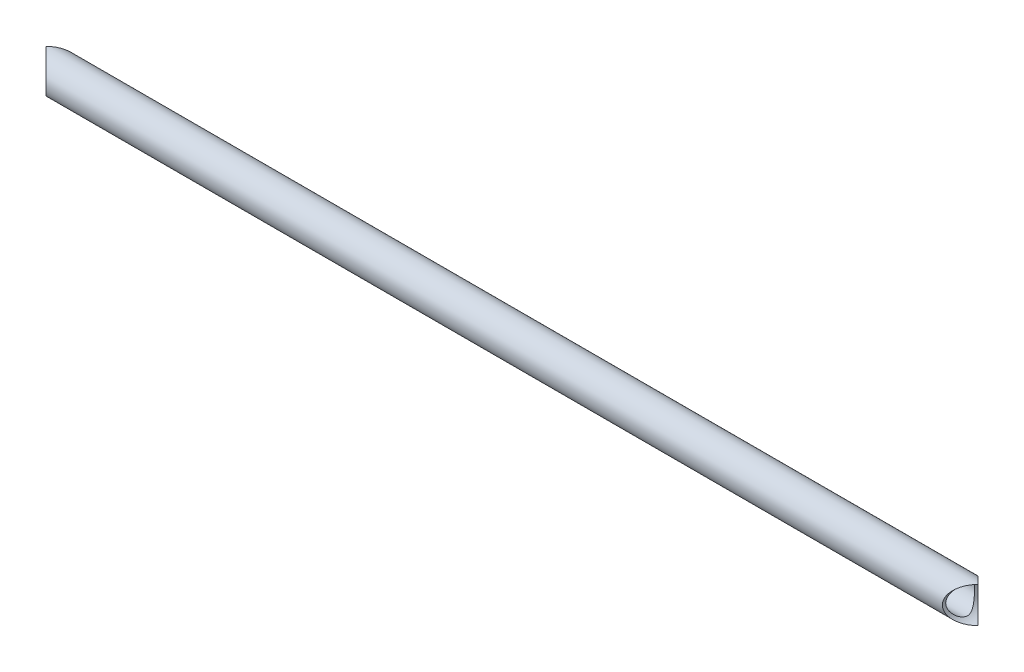
ISO-10303-21;
HEADER;
FILE_DESCRIPTION(('STEP AP214'),'2;1');
FILE_NAME('part.step','',(''),(''),'','','');
FILE_SCHEMA(('AUTOMOTIVE_DESIGN { 1 0 10303 214 1 1 1 1 }'));
ENDSEC;
DATA;
#1=APPLICATION_CONTEXT('core data for automotive mechanical design processes');
#2=APPLICATION_PROTOCOL_DEFINITION('international standard','automotive_design',2000,#1);
#3=PRODUCT_CONTEXT('',#1,'mechanical');
#4=PRODUCT('Part','Part','',(#3));
#5=PRODUCT_RELATED_PRODUCT_CATEGORY('part','',(#4));
#6=PRODUCT_DEFINITION_FORMATION('','',#4);
#7=PRODUCT_DEFINITION_CONTEXT('part definition',#1,'design');
#8=PRODUCT_DEFINITION('design','',#6,#7);
#9=PRODUCT_DEFINITION_SHAPE('','',#8);
#10=(LENGTH_UNIT() NAMED_UNIT(*) SI_UNIT(.MILLI.,.METRE.));
#11=(NAMED_UNIT(*) PLANE_ANGLE_UNIT() SI_UNIT($,.RADIAN.));
#12=(NAMED_UNIT(*) SI_UNIT($,.STERADIAN.) SOLID_ANGLE_UNIT());
#13=UNCERTAINTY_MEASURE_WITH_UNIT(LENGTH_MEASURE(1.E-05),#10,'distance_accuracy_value','');
#14=(GEOMETRIC_REPRESENTATION_CONTEXT(3) GLOBAL_UNCERTAINTY_ASSIGNED_CONTEXT((#13)) GLOBAL_UNIT_ASSIGNED_CONTEXT((#10,
#11,#12)) REPRESENTATION_CONTEXT('',''));
#15=CARTESIAN_POINT('',(0.,0.,0.));
#16=DIRECTION('',(0.,0.,1.));
#17=DIRECTION('',(1.,0.,0.));
#18=AXIS2_PLACEMENT_3D('',#15,#16,#17);
#19=CARTESIAN_POINT('',(473.575059000242,250.,-150.));
#20=DIRECTION('',(-1.,0.,0.));
#21=DIRECTION('',(0.,0.,1.));
#22=AXIS2_PLACEMENT_3D('',#19,#20,#21);
#23=CYLINDRICAL_SURFACE('',#22,6.43750000000001);
#24=CARTESIAN_POINT('',(465.637559000242,250.,-143.5625));
#25=CARTESIAN_POINT('',(465.637558402945,250.154053503878,-143.562499391556));
#26=CARTESIAN_POINT('',(465.642052514991,250.308099275992,-143.568038138028));
#27=CARTESIAN_POINT('',(465.659922986997,250.614941540752,-143.590092035003));
#28=CARTESIAN_POINT('',(465.673302692723,250.767737540864,-143.606611320101));
#29=CARTESIAN_POINT('',(465.708655653721,251.070948446745,-143.650356902694));
#30=CARTESIAN_POINT('',(465.730638552357,251.221360482769,-143.677595215392));
#31=CARTESIAN_POINT('',(465.782717711862,251.518586125078,-143.742328568781));
#32=CARTESIAN_POINT('',(465.812817650638,251.665398067148,-143.779828259111));
#33=CARTESIAN_POINT('',(465.880277025454,251.953449267325,-143.864218922048));
#34=CARTESIAN_POINT('',(465.917586095806,252.094719448489,-143.911044804405));
#35=CARTESIAN_POINT('',(465.998890087991,252.372022320857,-144.013614910819));
#36=CARTESIAN_POINT('',(466.042887924479,252.508052696251,-144.069363023331));
#37=CARTESIAN_POINT('',(466.183783326957,252.907302010116,-144.24899778753));
#38=CARTESIAN_POINT('',(466.289644026127,253.16193206833,-144.385350517994));
#39=CARTESIAN_POINT('',(466.481871396131,253.567010929785,-144.637618000806));
#40=CARTESIAN_POINT('',(466.563541007266,253.724607397373,-144.745978848296));
#41=CARTESIAN_POINT('',(466.733057595377,254.027529423989,-144.974429734421));
#42=CARTESIAN_POINT('',(466.820904379805,254.172855365191,-145.094519407503));
#43=CARTESIAN_POINT('',(467.001123795357,254.451392250007,-145.34577460804));
#44=CARTESIAN_POINT('',(467.093508366507,254.584568272048,-145.476970093886));
#45=CARTESIAN_POINT('',(467.280633396254,254.838279289999,-145.749457724651));
#46=CARTESIAN_POINT('',(467.375373575407,254.958815776558,-145.890748675645));
#47=CARTESIAN_POINT('',(467.566715558699,255.189073760003,-146.185491319495));
#48=CARTESIAN_POINT('',(467.663322202343,255.298583011971,-146.339105694759));
#49=CARTESIAN_POINT('',(467.854369884509,255.504300509459,-146.656372006318));
#50=CARTESIAN_POINT('',(467.94881021065,255.60050443045,-146.820027181263));
#51=CARTESIAN_POINT('',(468.132210405675,255.778893983945,-147.157106636377));
#52=CARTESIAN_POINT('',(468.221184137913,255.861116098408,-147.330503871995));
#53=CARTESIAN_POINT('',(468.389983747972,256.010958511803,-147.687581894719));
#54=CARTESIAN_POINT('',(468.469817469449,256.078591375499,-147.871253659951));
#55=CARTESIAN_POINT('',(468.625049937623,256.205858825104,-148.274067550822));
#56=CARTESIAN_POINT('',(468.698505687746,256.263293117879,-148.49470828632));
#57=CARTESIAN_POINT('',(468.7886532175,256.33211340765,-148.834206037823));
#58=CARTESIAN_POINT('',(468.815351653086,256.352157205264,-148.948713752504));
#59=CARTESIAN_POINT('',(468.861052538468,256.386146122896,-149.180122615271));
#60=CARTESIAN_POINT('',(468.880058910716,256.400094351548,-149.297022511467));
#61=CARTESIAN_POINT('',(468.909653400063,256.42170078256,-149.533705925838));
#62=CARTESIAN_POINT('',(468.920152850172,256.429292760756,-149.653506740305));
#63=CARTESIAN_POINT('',(468.931850738342,256.437746269686,-149.893799555816));
#64=CARTESIAN_POINT('',(468.933049744564,256.438608211556,-150.014291514189));
#65=CARTESIAN_POINT('',(468.926079212421,256.433576824116,-150.25492477921));
#66=CARTESIAN_POINT('',(468.917904520945,256.427679779109,-150.375065856549));
#67=CARTESIAN_POINT('',(468.892618633631,256.409282210686,-150.613889084128));
#68=CARTESIAN_POINT('',(468.875506213685,256.396780782732,-150.732571032246));
#69=CARTESIAN_POINT('',(468.83031815067,256.36335068114,-150.983507804089));
#70=CARTESIAN_POINT('',(468.801073466485,256.341511467071,-151.115429422037));
#71=CARTESIAN_POINT('',(468.733699388194,256.290224863835,-151.375526678794));
#72=CARTESIAN_POINT('',(468.695563442189,256.260771862381,-151.503699476357));
#73=CARTESIAN_POINT('',(468.611982553179,256.194724969012,-151.756089443869));
#74=CARTESIAN_POINT('',(468.566519802237,256.158113631189,-151.880296069582));
#75=CARTESIAN_POINT('',(468.469933038019,256.07828298027,-152.124229241604));
#76=CARTESIAN_POINT('',(468.418810355609,256.035065219692,-152.243956832283));
#77=CARTESIAN_POINT('',(468.284305805095,255.918056943437,-152.54069622316));
#78=CARTESIAN_POINT('',(468.198075317968,255.84012539004,-152.714792654879));
#79=CARTESIAN_POINT('',(468.019625869234,255.670647289894,-153.053026459661));
#80=CARTESIAN_POINT('',(467.927403915793,255.579093911201,-153.217158776784));
#81=CARTESIAN_POINT('',(467.739980425707,255.382769650977,-153.535853312281));
#82=CARTESIAN_POINT('',(467.644775337406,255.277982526309,-153.690403415812));
#83=CARTESIAN_POINT('',(467.454046702457,255.055549816154,-153.989683454179));
#84=CARTESIAN_POINT('',(467.358523214719,254.937906493827,-154.134415110172));
#85=CARTESIAN_POINT('',(467.166114392294,254.685653023963,-154.418523961216));
#86=CARTESIAN_POINT('',(467.069292067831,254.550603956061,-154.557555093309));
#87=CARTESIAN_POINT('',(466.879796854307,254.266904551233,-154.824191477672));
#88=CARTESIAN_POINT('',(466.787124590381,254.1182521754,-154.95179501145));
#89=CARTESIAN_POINT('',(466.608274306943,253.807864625268,-155.194253365156));
#90=CARTESIAN_POINT('',(466.522082495341,253.646158847191,-155.309135521118));
#91=CARTESIAN_POINT('',(466.358124069709,253.30979203333,-155.525086757303));
#92=CARTESIAN_POINT('',(466.280353879259,253.135136550421,-155.626161705857));
#93=CARTESIAN_POINT('',(466.155603700548,252.824061773107,-155.786848053874));
#94=CARTESIAN_POINT('',(466.106084830027,252.690559949619,-155.850162526401));
#95=CARTESIAN_POINT('',(466.013346169161,252.417675878495,-155.968109417081));
#96=CARTESIAN_POINT('',(465.97012482403,252.278295093303,-156.022743978505));
#97=CARTESIAN_POINT('',(465.890768990573,251.994321060996,-156.122640997188));
#98=CARTESIAN_POINT('',(465.854631182882,251.849730293081,-156.167907844741));
#99=CARTESIAN_POINT('',(465.79013047109,251.556080853704,-156.248455368065));
#100=CARTESIAN_POINT('',(465.761767747172,251.407022078788,-156.283735812408));
#101=CARTESIAN_POINT('',(465.713284787135,251.104540865761,-156.343919448379));
#102=CARTESIAN_POINT('',(465.693215000126,250.95109761985,-156.368759140214));
#103=CARTESIAN_POINT('',(465.662032022352,250.641910788222,-156.407310255803));
#104=CARTESIAN_POINT('',(465.650918823719,250.486167204525,-156.421021689332));
#105=CARTESIAN_POINT('',(465.637921037139,250.173742475161,-156.437055313857));
#106=CARTESIAN_POINT('',(465.636034459383,250.017061538941,-156.439379960521));
#107=CARTESIAN_POINT('',(465.641532265421,249.704117727591,-156.432600617426));
#108=CARTESIAN_POINT('',(465.648916039819,249.547854825657,-156.423497378891));
#109=CARTESIAN_POINT('',(465.671659322295,249.251556716677,-156.395411353785));
#110=CARTESIAN_POINT('',(465.686213798936,249.111363064157,-156.377425388494));
#111=CARTESIAN_POINT('',(465.722515440052,248.833325557361,-156.332465253853));
#112=CARTESIAN_POINT('',(465.744264997166,248.695482500803,-156.305488094562));
#113=CARTESIAN_POINT('',(465.794545524449,248.423076226467,-156.242934961735));
#114=CARTESIAN_POINT('',(465.823074260681,248.288511944309,-156.207361820758));
#115=CARTESIAN_POINT('',(465.886418789153,248.023300674713,-156.128070837357));
#116=CARTESIAN_POINT('',(465.921236949897,247.892655184723,-156.084349926405));
#117=CARTESIAN_POINT('',(466.037884071096,247.495349160689,-155.937190603802));
#118=CARTESIAN_POINT('',(466.12947674538,247.236221002269,-155.820741196208));
#119=CARTESIAN_POINT('',(466.332303706204,246.741456744872,-155.558945089496));
#120=CARTESIAN_POINT('',(466.443550955735,246.505836311668,-155.413579310838));
#121=CARTESIAN_POINT('',(466.647472103141,246.121086306473,-155.141466364289));
#122=CARTESIAN_POINT('',(466.736851309245,245.965979718342,-155.020576949893));
#123=CARTESIAN_POINT('',(466.920859331461,245.669179061505,-154.766917947317));
#124=CARTESIAN_POINT('',(467.015488190184,245.527485101696,-154.634148262698));
#125=CARTESIAN_POINT('',(467.208070775817,245.257326528774,-154.357288138531));
#126=CARTESIAN_POINT('',(467.306031614797,245.128892926884,-154.213172491584));
#127=CARTESIAN_POINT('',(467.502787706339,244.885719152578,-153.914413440138));
#128=CARTESIAN_POINT('',(467.601582755389,244.77097573811,-153.759772541862));
#129=CARTESIAN_POINT('',(467.782862498677,244.571396110627,-153.463897787413));
#130=CARTESIAN_POINT('',(467.865586003916,244.484650519112,-153.324094692025));
#131=CARTESIAN_POINT('',(468.027913420884,244.321415264178,-153.036837767629));
#132=CARTESIAN_POINT('',(468.107516909538,244.244926988274,-152.889382907294));
#133=CARTESIAN_POINT('',(468.261104637309,244.102821757114,-152.586990522472));
#134=CARTESIAN_POINT('',(468.335102042706,244.037178873221,-152.432072022661));
#135=CARTESIAN_POINT('',(468.474784537697,243.917272604688,-152.114397571707));
#136=CARTESIAN_POINT('',(468.540474442902,243.86300261542,-151.951646237271));
#137=CARTESIAN_POINT('',(468.676994124317,243.753194194026,-151.571047505676));
#138=CARTESIAN_POINT('',(468.744057559505,243.701606343269,-151.35059630133));
#139=CARTESIAN_POINT('',(468.823737777303,243.641544526172,-151.012218285778));
#140=CARTESIAN_POINT('',(468.846804664221,243.624415527955,-150.898210763888));
#141=CARTESIAN_POINT('',(468.885058594228,243.596222100269,-150.668161603093));
#142=CARTESIAN_POINT('',(468.900249521645,243.585154681149,-150.55212099613));
#143=CARTESIAN_POINT('',(468.922125128793,243.569269073924,-150.317819753693));
#144=CARTESIAN_POINT('',(468.928737371928,243.56450409582,-150.199548660526));
#145=CARTESIAN_POINT('',(468.932874500727,243.561519092758,-149.962766031049));
#146=CARTESIAN_POINT('',(468.930399723252,243.563298825185,-149.844254503815));
#147=CARTESIAN_POINT('',(468.916489326587,243.573359614817,-149.607960026931));
#148=CARTESIAN_POINT('',(468.90504735619,243.581645279997,-149.490177653337));
#149=CARTESIAN_POINT('',(468.873769097251,243.604521088464,-149.256310210572));
#150=CARTESIAN_POINT('',(468.853928221708,243.619114676868,-149.140226104791));
#151=CARTESIAN_POINT('',(468.802153281903,243.657720293088,-148.888173779707));
#152=CARTESIAN_POINT('',(468.768617290757,243.683012459214,-148.752731828128));
#153=CARTESIAN_POINT('',(468.692631757249,243.741557392194,-148.486076107853));
#154=CARTESIAN_POINT('',(468.650175191788,243.774816434215,-148.354865765117));
#155=CARTESIAN_POINT('',(468.558077749354,243.848797011514,-148.096799275815));
#156=CARTESIAN_POINT('',(468.50841946205,243.889536696825,-147.969954630201));
#157=CARTESIAN_POINT('',(468.403675049945,243.977924407442,-147.721086685232));
#158=CARTESIAN_POINT('',(468.348590344647,244.025570627588,-147.59906213662));
#159=CARTESIAN_POINT('',(468.205150770915,244.153518387237,-147.298375285436));
#160=CARTESIAN_POINT('',(468.11421188218,244.238042179885,-147.122732501561));
#161=CARTESIAN_POINT('',(467.927171874066,244.421250233546,-146.781861321673));
#162=CARTESIAN_POINT('',(467.831068321542,244.51994120616,-146.616637915466));
#163=CARTESIAN_POINT('',(467.636727159945,244.731153472898,-146.296285153479));
#164=CARTESIAN_POINT('',(467.538487253628,244.843690329446,-146.141167461248));
#165=CARTESIAN_POINT('',(467.342578125302,245.082285014452,-145.841373325777));
#166=CARTESIAN_POINT('',(467.244908806958,245.208340486584,-145.696695070249));
#167=CARTESIAN_POINT('',(467.049992452538,245.477206001213,-145.414739055637));
#168=CARTESIAN_POINT('',(466.952816001499,245.620354111429,-145.277733927736));
#169=CARTESIAN_POINT('',(466.763682073942,245.92071683623,-145.015972017119));
#170=CARTESIAN_POINT('',(466.67172546924,246.077933789359,-144.891217277935));
#171=CARTESIAN_POINT('',(466.495500805593,246.405792922135,-144.655493235382));
#172=CARTESIAN_POINT('',(466.411215852584,246.576403981817,-144.54449343662));
#173=CARTESIAN_POINT('',(466.252400132601,246.930762706863,-144.337559781626));
#174=CARTESIAN_POINT('',(466.177864145698,247.114503260076,-144.241617857348));
#175=CARTESIAN_POINT('',(466.061852380805,247.435783870791,-144.093462174367));
#176=CARTESIAN_POINT('',(466.017251371288,247.57019373361,-144.036865475296));
#177=CARTESIAN_POINT('',(465.934555782466,247.844288584193,-143.932396700578));
#178=CARTESIAN_POINT('',(465.896459530515,247.983972204538,-143.88452238183));
#179=CARTESIAN_POINT('',(465.827526266858,248.267685451375,-143.798190792309));
#180=CARTESIAN_POINT('',(465.796676201115,248.411706726981,-143.759716582095));
#181=CARTESIAN_POINT('',(465.742768645483,248.703417420287,-143.692649524719));
#182=CARTESIAN_POINT('',(465.719708533076,248.851105585504,-143.664053352006));
#183=CARTESIAN_POINT('',(465.679909637006,249.164551319225,-143.614773457378));
#184=CARTESIAN_POINT('',(465.664067784151,249.330601884134,-143.595209577302));
#185=CARTESIAN_POINT('',(465.642891451903,249.664437735419,-143.569071524454));
#186=CARTESIAN_POINT('',(465.637559650746,249.832223453011,-143.562500662644));
#187=CARTESIAN_POINT('',(465.637559000242,250.,-143.5625));
#188=B_SPLINE_CURVE_WITH_KNOTS('',3,(#24,#25,#26,#27,#28,#29,#30,#31,#32,#33,#34,#35,#36,#37,
#38,#39,#40,#41,#42,#43,#44,#45,#46,#47,#48,#49,#50,#51,#52,#53,#54,#55,#56,#57,#58,#59,#60,#61,
#62,#63,#64,#65,#66,#67,#68,#69,#70,#71,#72,#73,#74,#75,#76,#77,#78,#79,#80,#81,#82,#83,#84,#85,
#86,#87,#88,#89,#90,#91,#92,#93,#94,#95,#96,#97,#98,#99,#100,#101,#102,#103,#104,#105,#106,#107,
#108,#109,#110,#111,#112,#113,#114,#115,#116,#117,#118,#119,#120,#121,#122,#123,#124,#125,#126,
#127,#128,#129,#130,#131,#132,#133,#134,#135,#136,#137,#138,#139,#140,#141,#142,#143,#144,#145,
#146,#147,#148,#149,#150,#151,#152,#153,#154,#155,#156,#157,#158,#159,#160,#161,#162,#163,#164,
#165,#166,#167,#168,#169,#170,#171,#172,#173,#174,#175,#176,#177,#178,#179,#180,#181,#182,#183,
#184,#185,#186,#187),.UNSPECIFIED.,.T.,.F.,(4,2,2,2,2,2,2,2,2,2,2,2,2,2,2,2,2,2,2,2,2,2,2,2,2,2,
2,2,2,2,2,2,2,2,2,2,2,2,2,2,2,2,2,2,2,2,2,2,2,2,2,2,2,2,2,2,2,2,2,2,2,2,2,2,2,2,2,2,2,2,2,2,2,2,
2,2,2,2,2,2,2,4),(0.,0.461983804893523,0.924141663037798,1.38681904691481,1.84970642754534,
2.3094697619533,2.76943401716175,3.68855815609816,4.31176065043694,4.93494372754667,
5.55986497915275,6.18471244733901,6.81991133646268,7.45531619662535,8.08903680654515,
8.72220943601931,9.43812738361894,9.79559921838148,10.1528885354108,10.5138556034541,
10.8748006199652,11.2359441581722,11.5971371715182,12.0071413632324,12.4174486439691,
12.8287686563464,13.2399921562754,13.8670458475502,14.4944151006162,15.1225620117485,
15.7505985237143,16.3998516717724,17.0492022917971,17.6971293237189,18.3447801116171,
18.8118456346528,19.2787956485426,19.7455263224606,20.2122678116672,20.681808288357,
21.1513483526326,21.6207871517079,22.090195093326,22.5159769206619,22.9419004793906,
23.3676838781708,23.793627956319,24.6854741328242,25.577910729033,26.225151703376,
26.8723979322328,27.5211250939664,28.1696983207218,28.7217289303694,29.2738341384585,
29.8245996772341,30.3750444757329,31.080574226678,31.4329286227945,31.785109076243,
32.1402443178903,32.4953663946204,32.8507402217213,33.206308384489,33.6310660160361,
34.0561593174988,34.4822979741031,34.9083254510942,35.5526662184162,36.1973132512342,
36.8426915862967,37.4879576126266,38.1492313691104,38.8106152483937,39.4705055253029,
40.1300410153279,40.5871349208614,41.0441111107935,41.5002576314252,41.9562504351789,
42.4592594650593,42.9623966582976),.UNSPECIFIED.);
#189=CARTESIAN_POINT('',(465.637559000242,250.,-143.5625));
#190=VERTEX_POINT('',#189);
#191=EDGE_CURVE('E76',#190,#190,#188,.T.);
#192=ORIENTED_EDGE('',*,*,#191,.F.);
#193=EDGE_LOOP('',(#192));
#194=FACE_BOUND('',#193,.T.);
#195=CARTESIAN_POINT('',(66.4690782487256,250.,-143.5625));
#196=CARTESIAN_POINT('',(66.4690788460228,249.845946496122,-143.562499391556));
#197=CARTESIAN_POINT('',(66.4645847339768,249.691900724008,-143.568038138028));
#198=CARTESIAN_POINT('',(66.4467142619706,249.385058459248,-143.590092035003));
#199=CARTESIAN_POINT('',(66.433334556245,249.232262459136,-143.606611320101));
#200=CARTESIAN_POINT('',(66.3979815952464,248.929051553255,-143.650356902694));
#201=CARTESIAN_POINT('',(66.3759986966101,248.778639517231,-143.677595215392));
#202=CARTESIAN_POINT('',(66.3239195371053,248.481413874922,-143.742328568781));
#203=CARTESIAN_POINT('',(66.2938195983297,248.334601932852,-143.779828259111));
#204=CARTESIAN_POINT('',(66.2263602235137,248.046550732674,-143.864218922048));
#205=CARTESIAN_POINT('',(66.1890511531619,247.905280551511,-143.911044804405));
#206=CARTESIAN_POINT('',(66.1077471609762,247.627977679143,-144.013614910819));
#207=CARTESIAN_POINT('',(66.0637493244888,247.491947303749,-144.069363023331));
#208=CARTESIAN_POINT('',(65.9228539220106,247.092697989884,-144.24899778753));
#209=CARTESIAN_POINT('',(65.8169932228406,246.83806793167,-144.385350517994));
#210=CARTESIAN_POINT('',(65.6247658528365,246.432989070215,-144.637618000806));
#211=CARTESIAN_POINT('',(65.5430962417018,246.275392602627,-144.745978848296));
#212=CARTESIAN_POINT('',(65.3735796535906,245.972470576011,-144.974429734422));
#213=CARTESIAN_POINT('',(65.2857328691624,245.827144634809,-145.094519407503));
#214=CARTESIAN_POINT('',(65.10551345361,245.548607749993,-145.34577460804));
#215=CARTESIAN_POINT('',(65.0131288824604,245.415431727952,-145.476970093886));
#216=CARTESIAN_POINT('',(64.8260038527136,245.161720710001,-145.749457724651));
#217=CARTESIAN_POINT('',(64.7312636735601,245.041184223442,-145.890748675646));
#218=CARTESIAN_POINT('',(64.539921690268,244.810926239996,-146.185491319495));
#219=CARTESIAN_POINT('',(64.4433150466248,244.701416988029,-146.33910569476));
#220=CARTESIAN_POINT('',(64.2522673644585,244.495699490541,-146.656372006318));
#221=CARTESIAN_POINT('',(64.1578270383173,244.39949556955,-146.820027181263));
#222=CARTESIAN_POINT('',(63.9744268432921,244.221106016054,-147.157106636377));
#223=CARTESIAN_POINT('',(63.8854531110542,244.138883901592,-147.330503871995));
#224=CARTESIAN_POINT('',(63.7166535009951,243.989041488197,-147.687581894719));
#225=CARTESIAN_POINT('',(63.6368197795186,243.921408624501,-147.871253659952));
#226=CARTESIAN_POINT('',(63.481587311345,243.794141174896,-148.274067550822));
#227=CARTESIAN_POINT('',(63.408131561222,243.73670688212,-148.49470828632));
#228=CARTESIAN_POINT('',(63.3179840314675,243.66788659235,-148.834206037823));
#229=CARTESIAN_POINT('',(63.2912855958814,243.647842794736,-148.948713752504));
#230=CARTESIAN_POINT('',(63.2455847104989,243.613853877104,-149.180122615271));
#231=CARTESIAN_POINT('',(63.2265783382512,243.599905648452,-149.297022511467));
#232=CARTESIAN_POINT('',(63.1969838489047,243.57829921744,-149.533705925838));
#233=CARTESIAN_POINT('',(63.1864843987952,243.570707239244,-149.653506740305));
#234=CARTESIAN_POINT('',(63.1747865106252,243.562253730314,-149.893799555816));
#235=CARTESIAN_POINT('',(63.1735875044037,243.561391788444,-150.014291514189));
#236=CARTESIAN_POINT('',(63.1805580365462,243.566423175884,-150.254924779211));
#237=CARTESIAN_POINT('',(63.1887327280227,243.572320220891,-150.37506585655));
#238=CARTESIAN_POINT('',(63.2140186153361,243.590717789314,-150.613889084128));
#239=CARTESIAN_POINT('',(63.2311310352829,243.603219217268,-150.732571032246));
#240=CARTESIAN_POINT('',(63.2763190982972,243.63664931886,-150.983507804089));
#241=CARTESIAN_POINT('',(63.305563782482,243.658488532929,-151.115429422037));
#242=CARTESIAN_POINT('',(63.3729378607734,243.709775136165,-151.375526678794));
#243=CARTESIAN_POINT('',(63.4110738067781,243.739228137619,-151.503699476357));
#244=CARTESIAN_POINT('',(63.4946546957883,243.805275030988,-151.756089443869));
#245=CARTESIAN_POINT('',(63.5401174467303,243.841886368811,-151.880296069582));
#246=CARTESIAN_POINT('',(63.6367042109484,243.92171701973,-152.124229241604));
#247=CARTESIAN_POINT('',(63.6878268933585,243.964934780308,-152.243956832284));
#248=CARTESIAN_POINT('',(63.8223314438727,244.081943056564,-152.54069622316));
#249=CARTESIAN_POINT('',(63.9085619309992,244.15987460996,-152.714792654879));
#250=CARTESIAN_POINT('',(64.0870113797337,244.329352710106,-153.053026459661));
#251=CARTESIAN_POINT('',(64.1792333331748,244.4209060888,-153.217158776785));
#252=CARTESIAN_POINT('',(64.3666568232607,244.617230349023,-153.535853312281));
#253=CARTESIAN_POINT('',(64.4618619115612,244.722017473691,-153.690403415812));
#254=CARTESIAN_POINT('',(64.6525905465106,244.944450183846,-153.989683454179));
#255=CARTESIAN_POINT('',(64.7481140342484,245.062093506173,-154.134415110172));
#256=CARTESIAN_POINT('',(64.9405228566732,245.314346976037,-154.418523961217));
#257=CARTESIAN_POINT('',(65.0373451811363,245.449396043939,-154.557555093309));
#258=CARTESIAN_POINT('',(65.2268403946602,245.733095448768,-154.824191477673));
#259=CARTESIAN_POINT('',(65.3195126585866,245.8817478246,-154.951795011451));
#260=CARTESIAN_POINT('',(65.498362942025,246.192135374732,-155.194253365156));
#261=CARTESIAN_POINT('',(65.5845547536263,246.353841152809,-155.309135521118));
#262=CARTESIAN_POINT('',(65.7485131792583,246.69020796667,-155.525086757304));
#263=CARTESIAN_POINT('',(65.8262833697087,246.864863449579,-155.626161705857));
#264=CARTESIAN_POINT('',(65.9510335484195,247.175938226894,-155.786848053874));
#265=CARTESIAN_POINT('',(66.0005524189401,247.309440050382,-155.850162526401));
#266=CARTESIAN_POINT('',(66.0932910798063,247.582324121505,-155.968109417081));
#267=CARTESIAN_POINT('',(66.1365124249377,247.721704906698,-156.022743978505));
#268=CARTESIAN_POINT('',(66.2158682583945,248.005678939004,-156.122640997188));
#269=CARTESIAN_POINT('',(66.2520060660857,248.150269706919,-156.167907844741));
#270=CARTESIAN_POINT('',(66.3165067778776,248.443919146296,-156.248455368065));
#271=CARTESIAN_POINT('',(66.3448695017954,248.592977921212,-156.283735812408));
#272=CARTESIAN_POINT('',(66.3933524618327,248.89545913424,-156.343919448379));
#273=CARTESIAN_POINT('',(66.4134222488414,249.04890238015,-156.368759140214));
#274=CARTESIAN_POINT('',(66.4446052266157,249.358089211778,-156.407310255803));
#275=CARTESIAN_POINT('',(66.4557184252481,249.513832795475,-156.421021689332));
#276=CARTESIAN_POINT('',(66.4687162118287,249.826257524839,-156.437055313857));
#277=CARTESIAN_POINT('',(66.4706027895845,249.982938461059,-156.439379960521));
#278=CARTESIAN_POINT('',(66.4651049835461,250.29588227241,-156.432600617426));
#279=CARTESIAN_POINT('',(66.4577212091488,250.452145174343,-156.423497378891));
#280=CARTESIAN_POINT('',(66.4349779266728,250.748443283324,-156.395411353785));
#281=CARTESIAN_POINT('',(66.420423450031,250.888636935843,-156.377425388494));
#282=CARTESIAN_POINT('',(66.3841218089156,251.166674442639,-156.332465253853));
#283=CARTESIAN_POINT('',(66.3623722518012,251.304517499197,-156.305488094562));
#284=CARTESIAN_POINT('',(66.3120917245188,251.576923773533,-156.242934961735));
#285=CARTESIAN_POINT('',(66.283562988286,251.711488055691,-156.207361820758));
#286=CARTESIAN_POINT('',(66.2202184598146,251.976699325287,-156.128070837357));
#287=CARTESIAN_POINT('',(66.1854002990705,252.107344815278,-156.084349926405));
#288=CARTESIAN_POINT('',(66.0687531778717,252.504650839311,-155.937190603802));
#289=CARTESIAN_POINT('',(65.9771605035872,252.763778997731,-155.820741196208));
#290=CARTESIAN_POINT('',(65.7743335427632,253.258543255128,-155.558945089496));
#291=CARTESIAN_POINT('',(65.6630862932325,253.494163688332,-155.413579310838));
#292=CARTESIAN_POINT('',(65.459165145826,253.878913693528,-155.141466364288));
#293=CARTESIAN_POINT('',(65.3697859397221,254.034020281658,-155.020576949893));
#294=CARTESIAN_POINT('',(65.1857779175068,254.330820938495,-154.766917947317));
#295=CARTESIAN_POINT('',(65.0911490587832,254.472514898304,-154.634148262698));
#296=CARTESIAN_POINT('',(64.8985664731506,254.742673471226,-154.357288138531));
#297=CARTESIAN_POINT('',(64.8006056341703,254.871107073116,-154.213172491583));
#298=CARTESIAN_POINT('',(64.6038495426284,255.114280847423,-153.914413440138));
#299=CARTESIAN_POINT('',(64.5050544935786,255.22902426189,-153.759772541862));
#300=CARTESIAN_POINT('',(64.3237747502903,255.428603889373,-153.463897787412));
#301=CARTESIAN_POINT('',(64.2410512450513,255.515349480888,-153.324094692025));
#302=CARTESIAN_POINT('',(64.0787238280832,255.678584735822,-153.036837767629));
#303=CARTESIAN_POINT('',(63.9991203394298,255.755073011726,-152.889382907294));
#304=CARTESIAN_POINT('',(63.8455326116583,255.897178242886,-152.586990522471));
#305=CARTESIAN_POINT('',(63.7715352062612,255.962821126779,-152.432072022661));
#306=CARTESIAN_POINT('',(63.6318527112705,256.082727395312,-152.114397571707));
#307=CARTESIAN_POINT('',(63.5661628060654,256.136997384581,-151.951646237271));
#308=CARTESIAN_POINT('',(63.4296431246504,256.246805805974,-151.571047505676));
#309=CARTESIAN_POINT('',(63.362579689462,256.298393656731,-151.35059630133));
#310=CARTESIAN_POINT('',(63.2828994716648,256.358455473828,-151.012218285778));
#311=CARTESIAN_POINT('',(63.2598325847465,256.375584472045,-150.898210763887));
#312=CARTESIAN_POINT('',(63.2215786547396,256.403777899731,-150.668161603092));
#313=CARTESIAN_POINT('',(63.2063877273223,256.41484531885,-150.55212099613));
#314=CARTESIAN_POINT('',(63.1845121201748,256.430730926076,-150.317819753693));
#315=CARTESIAN_POINT('',(63.1778998770396,256.43549590418,-150.199548660526));
#316=CARTESIAN_POINT('',(63.1737627482403,256.438480907242,-149.962766031049));
#317=CARTESIAN_POINT('',(63.1762375257155,256.436701174815,-149.844254503815));
#318=CARTESIAN_POINT('',(63.1901479223808,256.426640385183,-149.607960026931));
#319=CARTESIAN_POINT('',(63.2015898927771,256.418354720003,-149.490177653337));
#320=CARTESIAN_POINT('',(63.2328681517166,256.395478911536,-149.256310210571));
#321=CARTESIAN_POINT('',(63.2527090272591,256.380885323132,-149.140226104791));
#322=CARTESIAN_POINT('',(63.3044839670649,256.342279706912,-148.888173779707));
#323=CARTESIAN_POINT('',(63.3380199582105,256.316987540786,-148.752731828128));
#324=CARTESIAN_POINT('',(63.4140054917185,256.258442607806,-148.486076107853));
#325=CARTESIAN_POINT('',(63.45646205718,256.225183565785,-148.354865765117));
#326=CARTESIAN_POINT('',(63.5485594996131,256.151202988486,-148.096799275815));
#327=CARTESIAN_POINT('',(63.5982177869175,256.110463303175,-147.969954630201));
#328=CARTESIAN_POINT('',(63.7029621990228,256.022075592558,-147.721086685232));
#329=CARTESIAN_POINT('',(63.7580469043202,255.974429372412,-147.59906213662));
#330=CARTESIAN_POINT('',(63.9014864780529,255.846481612763,-147.298375285435));
#331=CARTESIAN_POINT('',(63.9924253667878,255.761957820115,-147.122732501561));
#332=CARTESIAN_POINT('',(64.1794653749015,255.578749766454,-146.781861321672));
#333=CARTESIAN_POINT('',(64.2755689274259,255.48005879384,-146.616637915465));
#334=CARTESIAN_POINT('',(64.4699100890221,255.268846527102,-146.296285153479));
#335=CARTESIAN_POINT('',(64.5681499953392,255.156309670554,-146.141167461248));
#336=CARTESIAN_POINT('',(64.7640591236653,254.917714985548,-145.841373325777));
#337=CARTESIAN_POINT('',(64.8617284420099,254.791659513416,-145.696695070249));
#338=CARTESIAN_POINT('',(65.0566447964301,254.522793998787,-145.414739055636));
#339=CARTESIAN_POINT('',(65.1538212474684,254.379645888571,-145.277733927736));
#340=CARTESIAN_POINT('',(65.342955175026,254.079283163769,-145.015972017118));
#341=CARTESIAN_POINT('',(65.4349117797274,253.92206621064,-144.891217277935));
#342=CARTESIAN_POINT('',(65.6111364433749,253.594207077864,-144.655493235382));
#343=CARTESIAN_POINT('',(65.6954213963834,253.423596018183,-144.544493436619));
#344=CARTESIAN_POINT('',(65.8542371163664,253.069237293137,-144.337559781626));
#345=CARTESIAN_POINT('',(65.9287731032693,252.885496739924,-144.241617857347));
#346=CARTESIAN_POINT('',(66.0447848681624,252.564216129209,-144.093462174367));
#347=CARTESIAN_POINT('',(66.0893858776796,252.42980626639,-144.036865475296));
#348=CARTESIAN_POINT('',(66.1720814665018,252.155711415806,-143.932396700578));
#349=CARTESIAN_POINT('',(66.2101777184527,252.016027795461,-143.88452238183));
#350=CARTESIAN_POINT('',(66.27911098211,251.732314548625,-143.798190792309));
#351=CARTESIAN_POINT('',(66.3099610478526,251.588293273019,-143.759716582095));
#352=CARTESIAN_POINT('',(66.3638686034844,251.296582579713,-143.692649524719));
#353=CARTESIAN_POINT('',(66.3869287158914,251.148894414496,-143.664053352006));
#354=CARTESIAN_POINT('',(66.4267276119614,250.835448680774,-143.614773457378));
#355=CARTESIAN_POINT('',(66.4425694648162,250.669398115866,-143.595209577302));
#356=CARTESIAN_POINT('',(66.4637457970648,250.335562264581,-143.569071524454));
#357=CARTESIAN_POINT('',(66.4690775982213,250.167776546989,-143.562500662644));
#358=CARTESIAN_POINT('',(66.4690782487256,250.,-143.5625));
#359=B_SPLINE_CURVE_WITH_KNOTS('',3,(#195,#196,#197,#198,#199,#200,#201,#202,#203,#204,#205,
#206,#207,#208,#209,#210,#211,#212,#213,#214,#215,#216,#217,#218,#219,#220,#221,#222,#223,#224,
#225,#226,#227,#228,#229,#230,#231,#232,#233,#234,#235,#236,#237,#238,#239,#240,#241,#242,#243,
#244,#245,#246,#247,#248,#249,#250,#251,#252,#253,#254,#255,#256,#257,#258,#259,#260,#261,#262,
#263,#264,#265,#266,#267,#268,#269,#270,#271,#272,#273,#274,#275,#276,#277,#278,#279,#280,#281,
#282,#283,#284,#285,#286,#287,#288,#289,#290,#291,#292,#293,#294,#295,#296,#297,#298,#299,#300,
#301,#302,#303,#304,#305,#306,#307,#308,#309,#310,#311,#312,#313,#314,#315,#316,#317,#318,#319,
#320,#321,#322,#323,#324,#325,#326,#327,#328,#329,#330,#331,#332,#333,#334,#335,#336,#337,#338,
#339,#340,#341,#342,#343,#344,#345,#346,#347,#348,#349,#350,#351,#352,#353,#354,#355,#356,#357,
#358),.UNSPECIFIED.,.T.,.F.,(4,2,2,2,2,2,2,2,2,2,2,2,2,2,2,2,2,2,2,2,2,2,2,2,2,2,2,2,2,2,2,2,2,
2,2,2,2,2,2,2,2,2,2,2,2,2,2,2,2,2,2,2,2,2,2,2,2,2,2,2,2,2,2,2,2,2,2,2,2,2,2,2,2,2,2,2,2,2,2,2,2,
4),(0.,0.461983804893523,0.924141663037825,1.3868190469149,1.84970642754537,2.30946976195328,
2.76943401716176,3.68855815609816,4.31176065043693,4.93494372754678,5.55986497915285,
6.18471244733907,6.81991133646275,7.4553161966254,8.08903680654521,8.72220943601939,
9.43812738361905,9.79559921838159,10.1528885354109,10.5138556034542,10.8748006199653,
11.2359441581722,11.5971371715183,12.0071413632326,12.4174486439693,12.8287686563465,
13.2399921562755,13.8670458475503,14.4944151006164,15.1225620117487,15.7505985237145,
16.3998516717727,17.0492022917973,17.6971293237191,18.3447801116175,18.8118456346531,
19.2787956485429,19.7455263224609,20.2122678116674,20.6818082883572,21.1513483526329,
21.6207871517082,22.0901950933263,22.5159769206621,22.9419004793907,23.367683878171,
23.7936279563193,24.6854741328245,25.5779107290333,26.2251517033763,26.8723979322331,
27.5211250939668,28.1696983207221,28.7217289303696,29.2738341384587,29.8245996772344,
30.3750444757331,31.0805742266782,31.4329286227946,31.7851090762432,32.1402443178905,
32.4953663946205,32.8507402217214,33.2063083844892,33.6310660160363,34.0561593174991,
34.4822979741033,34.9083254510945,35.5526662184165,36.1973132512346,36.8426915862971,
37.487957612627,38.1492313691108,38.8106152483941,39.4705055253033,40.1300410153284,
40.5871349208619,41.044111110794,41.5002576314257,41.9562504351793,42.4592594650595,
42.9623966582976),.UNSPECIFIED.);
#360=CARTESIAN_POINT('',(66.4690782487256,250.,-143.5625));
#361=VERTEX_POINT('',#360);
#362=EDGE_CURVE('E12',#361,#361,#359,.T.);
#363=ORIENTED_EDGE('',*,*,#362,.F.);
#364=EDGE_LOOP('',(#363));
#365=FACE_BOUND('',#364,.T.);
#366=ADVANCED_FACE('F43',(#194,#365),#23,.F.);
#367=CARTESIAN_POINT('',(473.575059000242,250.,-150.));
#368=DIRECTION('',(-1.,0.,0.));
#369=DIRECTION('',(0.,0.,1.));
#370=AXIS2_PLACEMENT_3D('',#367,#368,#369);
#371=CYLINDRICAL_SURFACE('',#370,7.93750000000001);
#372=CARTESIAN_POINT('',(473.575059000242,250.,-150.));
#373=DIRECTION('',(-0.707106781186547,0.,-0.707106781186547));
#374=DIRECTION('',(-0.707106781186548,0.,0.707106781186547));
#375=AXIS2_PLACEMENT_3D('',#372,#373,#374);
#376=ELLIPSE('',#375,11.2253201513364,7.93749999999999);
#377=CARTESIAN_POINT('',(473.575059000242,242.0625,-150.));
#378=VERTEX_POINT('',#377);
#379=CARTESIAN_POINT('',(473.575059000242,257.9375,-150.));
#380=VERTEX_POINT('',#379);
#381=EDGE_CURVE('E75',#378,#380,#376,.T.);
#382=ORIENTED_EDGE('',*,*,#381,.T.);
#383=CARTESIAN_POINT('',(473.575059000242,250.,-150.));
#384=DIRECTION('',(-0.707106781186548,0.,0.707106781186547));
#385=DIRECTION('',(-0.707106781186547,0.,-0.707106781186547));
#386=AXIS2_PLACEMENT_3D('',#383,#384,#385);
#387=ELLIPSE('',#386,11.2253201513364,7.93749999999999);
#388=EDGE_CURVE('E61',#380,#378,#387,.T.);
#389=ORIENTED_EDGE('',*,*,#388,.T.);
#390=EDGE_LOOP('',(#382,#389));
#391=FACE_BOUND('',#390,.T.);
#392=CARTESIAN_POINT('',(58.5315782487256,250.,-150.));
#393=DIRECTION('',(-0.707106781186548,0.,0.707106781186547));
#394=DIRECTION('',(-0.707106781186547,0.,-0.707106781186547));
#395=AXIS2_PLACEMENT_3D('',#392,#393,#394);
#396=ELLIPSE('',#395,11.2253201513364,7.93749999999999);
#397=CARTESIAN_POINT('',(58.5315782487256,257.9375,-150.));
#398=VERTEX_POINT('',#397);
#399=CARTESIAN_POINT('',(58.5315782487256,242.0625,-150.));
#400=VERTEX_POINT('',#399);
#401=EDGE_CURVE('E55',#398,#400,#396,.F.);
#402=ORIENTED_EDGE('',*,*,#401,.T.);
#403=CARTESIAN_POINT('',(58.5315782487256,250.,-150.));
#404=DIRECTION('',(-0.707106781186547,0.,-0.707106781186547));
#405=DIRECTION('',(-0.707106781186548,0.,0.707106781186547));
#406=AXIS2_PLACEMENT_3D('',#403,#404,#405);
#407=ELLIPSE('',#406,11.2253201513364,7.93749999999999);
#408=EDGE_CURVE('E87',#400,#398,#407,.F.);
#409=ORIENTED_EDGE('',*,*,#408,.T.);
#410=EDGE_LOOP('',(#402,#409));
#411=FACE_BOUND('',#410,.T.);
#412=ADVANCED_FACE('F73',(#391,#411),#371,.T.);
#413=CARTESIAN_POINT('',(58.5315782487256,250.,-157.9375));
#414=DIRECTION('',(0.,0.,1.));
#415=DIRECTION('',(1.,0.,0.));
#416=AXIS2_PLACEMENT_3D('',#413,#414,#415);
#417=CYLINDRICAL_SURFACE('',#416,7.93749999999998);
#418=ORIENTED_EDGE('',*,*,#362,.T.);
#419=EDGE_LOOP('',(#418));
#420=FACE_BOUND('',#419,.T.);
#421=ORIENTED_EDGE('',*,*,#408,.F.);
#422=ORIENTED_EDGE('',*,*,#401,.F.);
#423=EDGE_LOOP('',(#421,#422));
#424=FACE_BOUND('',#423,.T.);
#425=ADVANCED_FACE('F90',(#420,#424),#417,.F.);
#426=CARTESIAN_POINT('',(473.575059000242,250.,-157.9375));
#427=DIRECTION('',(0.,0.,1.));
#428=DIRECTION('',(1.,0.,0.));
#429=AXIS2_PLACEMENT_3D('',#426,#427,#428);
#430=CYLINDRICAL_SURFACE('',#429,7.93749999999998);
#431=ORIENTED_EDGE('',*,*,#191,.T.);
#432=EDGE_LOOP('',(#431));
#433=FACE_BOUND('',#432,.T.);
#434=ORIENTED_EDGE('',*,*,#381,.F.);
#435=ORIENTED_EDGE('',*,*,#388,.F.);
#436=EDGE_LOOP('',(#434,#435));
#437=FACE_BOUND('',#436,.T.);
#438=ADVANCED_FACE('F78',(#433,#437),#430,.F.);
#439=CLOSED_SHELL('',(#366,#412,#425,#438));
#440=MANIFOLD_SOLID_BREP('B2',#439);
#441=ADVANCED_BREP_SHAPE_REPRESENTATION('',(#18,#440),#14);
#442=SHAPE_DEFINITION_REPRESENTATION(#9,#441);
ENDSEC;
END-ISO-10303-21;
